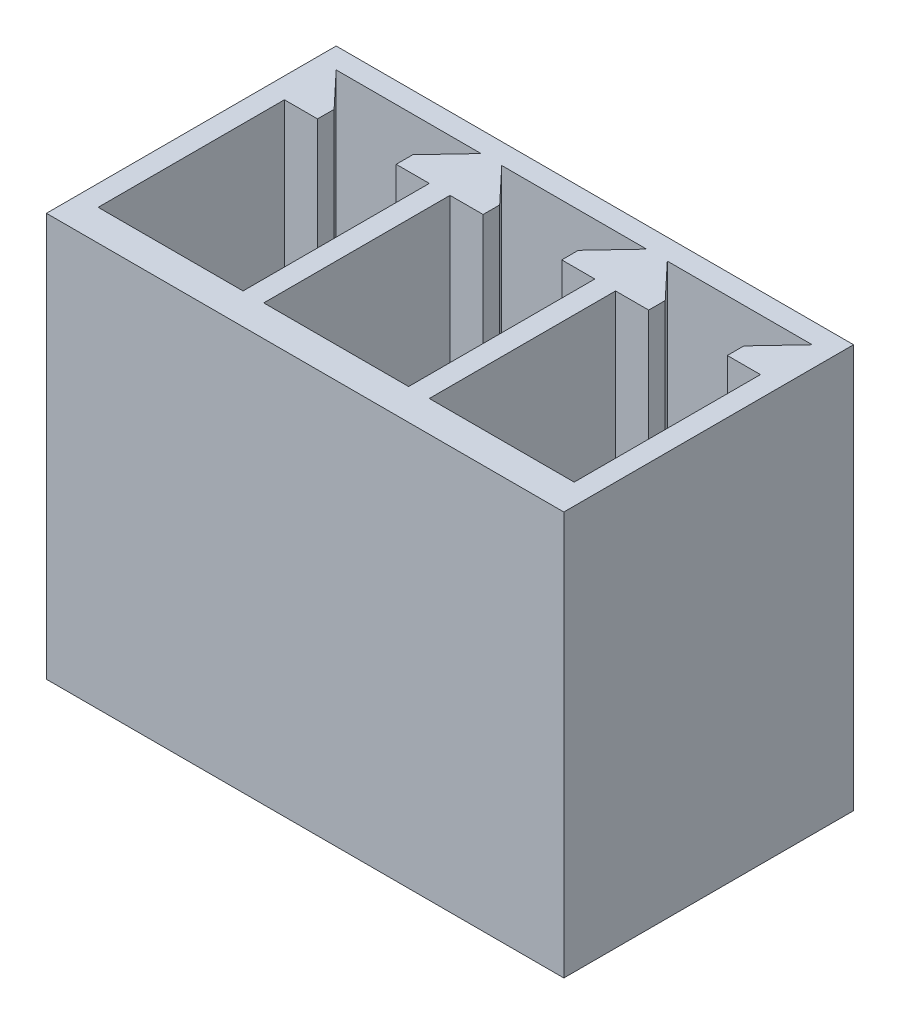
ISO-10303-21;
HEADER;
FILE_DESCRIPTION(('STEP AP214'),'2;1');
FILE_NAME('part.step','',(''),(''),'','','');
FILE_SCHEMA(('AUTOMOTIVE_DESIGN { 1 0 10303 214 1 1 1 1 }'));
ENDSEC;
DATA;
#1=APPLICATION_CONTEXT('core data for automotive mechanical design processes');
#2=APPLICATION_PROTOCOL_DEFINITION('international standard','automotive_design',2000,#1);
#3=PRODUCT_CONTEXT('',#1,'mechanical');
#4=PRODUCT('Part','Part','',(#3));
#5=PRODUCT_RELATED_PRODUCT_CATEGORY('part','',(#4));
#6=PRODUCT_DEFINITION_FORMATION('','',#4);
#7=PRODUCT_DEFINITION_CONTEXT('part definition',#1,'design');
#8=PRODUCT_DEFINITION('design','',#6,#7);
#9=PRODUCT_DEFINITION_SHAPE('','',#8);
#10=(LENGTH_UNIT() NAMED_UNIT(*) SI_UNIT(.MILLI.,.METRE.));
#11=(NAMED_UNIT(*) PLANE_ANGLE_UNIT() SI_UNIT($,.RADIAN.));
#12=(NAMED_UNIT(*) SI_UNIT($,.STERADIAN.) SOLID_ANGLE_UNIT());
#13=UNCERTAINTY_MEASURE_WITH_UNIT(LENGTH_MEASURE(1.E-05),#10,'distance_accuracy_value','');
#14=(GEOMETRIC_REPRESENTATION_CONTEXT(3) GLOBAL_UNCERTAINTY_ASSIGNED_CONTEXT((#13)) GLOBAL_UNIT_ASSIGNED_CONTEXT((#10,
#11,#12)) REPRESENTATION_CONTEXT('',''));
#15=CARTESIAN_POINT('',(0.,0.,0.));
#16=DIRECTION('',(0.,0.,1.));
#17=DIRECTION('',(1.,0.,0.));
#18=AXIS2_PLACEMENT_3D('',#15,#16,#17);
#19=CARTESIAN_POINT('',(0.,9.25,0.));
#20=DIRECTION('',(0.,1.,0.));
#21=DIRECTION('',(0.,0.,1.));
#22=AXIS2_PLACEMENT_3D('',#19,#20,#21);
#23=PLANE('',#22);
#24=DIRECTION('',(1.,0.,0.));
#25=VECTOR('',#24,1.);
#26=CARTESIAN_POINT('',(-6.24999999999998,9.25,0.));
#27=LINE('',#26,#25);
#28=CARTESIAN_POINT('',(-6.24999999999998,9.25,0.));
#29=VERTEX_POINT('',#28);
#30=CARTESIAN_POINT('',(6.25000000000001,9.25,0.));
#31=VERTEX_POINT('',#30);
#32=EDGE_CURVE('E491',#29,#31,#27,.T.);
#33=ORIENTED_EDGE('',*,*,#32,.T.);
#34=DIRECTION('',(0.,0.,-1.));
#35=VECTOR('',#34,1.);
#36=CARTESIAN_POINT('',(6.25000000000001,9.25,0.));
#37=LINE('',#36,#35);
#38=CARTESIAN_POINT('',(6.25000000000001,9.25,-6.99999999999999));
#39=VERTEX_POINT('',#38);
#40=EDGE_CURVE('E258',#31,#39,#37,.T.);
#41=ORIENTED_EDGE('',*,*,#40,.T.);
#42=DIRECTION('',(-1.,0.,0.));
#43=VECTOR('',#42,1.);
#44=CARTESIAN_POINT('',(6.25000000000001,9.25,-6.99999999999999));
#45=LINE('',#44,#43);
#46=CARTESIAN_POINT('',(-6.24999999999998,9.25,-6.99999999999999));
#47=VERTEX_POINT('',#46);
#48=EDGE_CURVE('E494',#39,#47,#45,.T.);
#49=ORIENTED_EDGE('',*,*,#48,.T.);
#50=DIRECTION('',(0.,0.,1.));
#51=VECTOR('',#50,1.);
#52=CARTESIAN_POINT('',(-6.24999999999998,9.25,-6.99999999999999));
#53=LINE('',#52,#51);
#54=EDGE_CURVE('E496',#47,#29,#53,.T.);
#55=ORIENTED_EDGE('',*,*,#54,.T.);
#56=EDGE_LOOP('',(#33,#41,#49,#55));
#57=FACE_BOUND('',#56,.T.);
#58=DIRECTION('',(0.,0.,1.));
#59=VECTOR('',#58,1.);
#60=CARTESIAN_POINT('',(-5.74999999999998,9.25,-5.25));
#61=LINE('',#60,#59);
#62=CARTESIAN_POINT('',(-5.74999999999998,9.25,-5.25));
#63=VERTEX_POINT('',#62);
#64=CARTESIAN_POINT('',(-5.74999999999998,9.25,-0.750000000000001));
#65=VERTEX_POINT('',#64);
#66=EDGE_CURVE('E422',#63,#65,#61,.T.);
#67=ORIENTED_EDGE('',*,*,#66,.F.);
#68=DIRECTION('',(-1.,0.,0.));
#69=VECTOR('',#68,1.);
#70=CARTESIAN_POINT('',(-4.94999999999998,9.25,-5.25));
#71=LINE('',#70,#69);
#72=CARTESIAN_POINT('',(-4.94999999999998,9.25,-5.25));
#73=VERTEX_POINT('',#72);
#74=EDGE_CURVE('E420',#73,#63,#71,.T.);
#75=ORIENTED_EDGE('',*,*,#74,.F.);
#76=DIRECTION('',(0.,0.,1.));
#77=VECTOR('',#76,1.);
#78=CARTESIAN_POINT('',(-4.94999999999998,9.25,-5.65));
#79=LINE('',#78,#77);
#80=CARTESIAN_POINT('',(-4.94999999999998,9.25,-5.65));
#81=VERTEX_POINT('',#80);
#82=EDGE_CURVE('E440',#81,#73,#79,.T.);
#83=ORIENTED_EDGE('',*,*,#82,.F.);
#84=DIRECTION('',(0.685364699004987,0.,0.728199992692806));
#85=VECTOR('',#84,1.);
#86=CARTESIAN_POINT('',(-5.74999999999998,9.25,-6.50000000000001));
#87=LINE('',#86,#85);
#88=CARTESIAN_POINT('',(-5.74999999999998,9.25,-6.50000000000001));
#89=VERTEX_POINT('',#88);
#90=EDGE_CURVE('E437',#89,#81,#87,.T.);
#91=ORIENTED_EDGE('',*,*,#90,.F.);
#92=DIRECTION('',(-1.,0.,0.));
#93=VECTOR('',#92,1.);
#94=CARTESIAN_POINT('',(-2.24999999999997,9.25,-6.50000000000001));
#95=LINE('',#94,#93);
#96=CARTESIAN_POINT('',(-2.24999999999997,9.25,-6.50000000000001));
#97=VERTEX_POINT('',#96);
#98=EDGE_CURVE('E435',#97,#89,#95,.T.);
#99=ORIENTED_EDGE('',*,*,#98,.F.);
#100=DIRECTION('',(0.685364699005,0.,-0.728199992692795));
#101=VECTOR('',#100,1.);
#102=CARTESIAN_POINT('',(-3.05,9.25,-5.65));
#103=LINE('',#102,#101);
#104=CARTESIAN_POINT('',(-3.05,9.25,-5.65));
#105=VERTEX_POINT('',#104);
#106=EDGE_CURVE('E433',#105,#97,#103,.T.);
#107=ORIENTED_EDGE('',*,*,#106,.F.);
#108=DIRECTION('',(0.,0.,-1.));
#109=VECTOR('',#108,1.);
#110=CARTESIAN_POINT('',(-3.05,9.25,-5.25));
#111=LINE('',#110,#109);
#112=CARTESIAN_POINT('',(-3.05,9.25,-5.25));
#113=VERTEX_POINT('',#112);
#114=EDGE_CURVE('E431',#113,#105,#111,.T.);
#115=ORIENTED_EDGE('',*,*,#114,.F.);
#116=DIRECTION('',(-1.,0.,0.));
#117=VECTOR('',#116,1.);
#118=CARTESIAN_POINT('',(-2.24999999999997,9.25,-5.25));
#119=LINE('',#118,#117);
#120=CARTESIAN_POINT('',(-2.24999999999997,9.25,-5.25));
#121=VERTEX_POINT('',#120);
#122=EDGE_CURVE('E429',#121,#113,#119,.T.);
#123=ORIENTED_EDGE('',*,*,#122,.F.);
#124=DIRECTION('',(0.,0.,-1.));
#125=VECTOR('',#124,1.);
#126=CARTESIAN_POINT('',(-2.24999999999997,9.25,-0.750000000000001));
#127=LINE('',#126,#125);
#128=CARTESIAN_POINT('',(-2.24999999999997,9.25,-0.750000000000001));
#129=VERTEX_POINT('',#128);
#130=EDGE_CURVE('E427',#129,#121,#127,.T.);
#131=ORIENTED_EDGE('',*,*,#130,.F.);
#132=DIRECTION('',(1.,0.,0.));
#133=VECTOR('',#132,1.);
#134=CARTESIAN_POINT('',(-5.74999999999998,9.25,-0.750000000000001));
#135=LINE('',#134,#133);
#136=EDGE_CURVE('E425',#65,#129,#135,.T.);
#137=ORIENTED_EDGE('',*,*,#136,.F.);
#138=EDGE_LOOP('',(#67,#75,#83,#91,#99,#107,#115,#123,#131,#137));
#139=FACE_BOUND('',#138,.T.);
#140=DIRECTION('',(0.,0.,1.));
#141=VECTOR('',#140,1.);
#142=CARTESIAN_POINT('',(-1.74999999999997,9.25,-5.25));
#143=LINE('',#142,#141);
#144=CARTESIAN_POINT('',(-1.74999999999997,9.25,-5.25));
#145=VERTEX_POINT('',#144);
#146=CARTESIAN_POINT('',(-1.74999999999997,9.25,-0.750000000000001));
#147=VERTEX_POINT('',#146);
#148=EDGE_CURVE('E352',#145,#147,#143,.T.);
#149=ORIENTED_EDGE('',*,*,#148,.F.);
#150=DIRECTION('',(-1.,0.,0.));
#151=VECTOR('',#150,1.);
#152=CARTESIAN_POINT('',(-0.950000000000006,9.25,-5.25));
#153=LINE('',#152,#151);
#154=CARTESIAN_POINT('',(-0.950000000000006,9.25,-5.25));
#155=VERTEX_POINT('',#154);
#156=EDGE_CURVE('E350',#155,#145,#153,.T.);
#157=ORIENTED_EDGE('',*,*,#156,.F.);
#158=DIRECTION('',(0.,0.,1.));
#159=VECTOR('',#158,1.);
#160=CARTESIAN_POINT('',(-0.950000000000006,9.25,-5.65));
#161=LINE('',#160,#159);
#162=CARTESIAN_POINT('',(-0.950000000000006,9.25,-5.65));
#163=VERTEX_POINT('',#162);
#164=EDGE_CURVE('E369',#163,#155,#161,.T.);
#165=ORIENTED_EDGE('',*,*,#164,.F.);
#166=DIRECTION('',(0.685364699004975,0.,0.728199992692818));
#167=VECTOR('',#166,1.);
#168=CARTESIAN_POINT('',(-1.74999999999997,9.25,-6.50000000000001));
#169=LINE('',#168,#167);
#170=CARTESIAN_POINT('',(-1.74999999999997,9.25,-6.50000000000001));
#171=VERTEX_POINT('',#170);
#172=EDGE_CURVE('E367',#171,#163,#169,.T.);
#173=ORIENTED_EDGE('',*,*,#172,.F.);
#174=DIRECTION('',(-1.,0.,0.));
#175=VECTOR('',#174,1.);
#176=CARTESIAN_POINT('',(1.75000000000003,9.25,-6.50000000000001));
#177=LINE('',#176,#175);
#178=CARTESIAN_POINT('',(1.75000000000003,9.25,-6.50000000000001));
#179=VERTEX_POINT('',#178);
#180=EDGE_CURVE('E365',#179,#171,#177,.T.);
#181=ORIENTED_EDGE('',*,*,#180,.F.);
#182=DIRECTION('',(0.685364699005,0.,-0.728199992692795));
#183=VECTOR('',#182,1.);
#184=CARTESIAN_POINT('',(0.950000000000006,9.25,-5.65));
#185=LINE('',#184,#183);
#186=CARTESIAN_POINT('',(0.950000000000006,9.25,-5.65));
#187=VERTEX_POINT('',#186);
#188=EDGE_CURVE('E363',#187,#179,#185,.T.);
#189=ORIENTED_EDGE('',*,*,#188,.F.);
#190=DIRECTION('',(0.,0.,-1.));
#191=VECTOR('',#190,1.);
#192=CARTESIAN_POINT('',(0.950000000000006,9.25,-5.25));
#193=LINE('',#192,#191);
#194=CARTESIAN_POINT('',(0.950000000000006,9.25,-5.25));
#195=VERTEX_POINT('',#194);
#196=EDGE_CURVE('E361',#195,#187,#193,.T.);
#197=ORIENTED_EDGE('',*,*,#196,.F.);
#198=DIRECTION('',(-1.,0.,0.));
#199=VECTOR('',#198,1.);
#200=CARTESIAN_POINT('',(1.75000000000003,9.25,-5.25));
#201=LINE('',#200,#199);
#202=CARTESIAN_POINT('',(1.75000000000003,9.25,-5.25));
#203=VERTEX_POINT('',#202);
#204=EDGE_CURVE('E359',#203,#195,#201,.T.);
#205=ORIENTED_EDGE('',*,*,#204,.F.);
#206=DIRECTION('',(0.,0.,-1.));
#207=VECTOR('',#206,1.);
#208=CARTESIAN_POINT('',(1.75000000000003,9.25,-0.750000000000001));
#209=LINE('',#208,#207);
#210=CARTESIAN_POINT('',(1.75000000000003,9.25,-0.750000000000001));
#211=VERTEX_POINT('',#210);
#212=EDGE_CURVE('E357',#211,#203,#209,.T.);
#213=ORIENTED_EDGE('',*,*,#212,.F.);
#214=DIRECTION('',(1.,0.,0.));
#215=VECTOR('',#214,1.);
#216=CARTESIAN_POINT('',(-1.74999999999997,9.25,-0.750000000000001));
#217=LINE('',#216,#215);
#218=EDGE_CURVE('E355',#147,#211,#217,.T.);
#219=ORIENTED_EDGE('',*,*,#218,.F.);
#220=EDGE_LOOP('',(#149,#157,#165,#173,#181,#189,#197,#205,#213,#219));
#221=FACE_BOUND('',#220,.T.);
#222=DIRECTION('',(0.,0.,1.));
#223=VECTOR('',#222,1.);
#224=CARTESIAN_POINT('',(2.25000000000003,9.25,-5.25));
#225=LINE('',#224,#223);
#226=CARTESIAN_POINT('',(2.25000000000003,9.25,-5.25));
#227=VERTEX_POINT('',#226);
#228=CARTESIAN_POINT('',(2.25000000000003,9.25,-0.750000000000001));
#229=VERTEX_POINT('',#228);
#230=EDGE_CURVE('E282',#227,#229,#225,.T.);
#231=ORIENTED_EDGE('',*,*,#230,.F.);
#232=DIRECTION('',(-1.,0.,0.));
#233=VECTOR('',#232,1.);
#234=CARTESIAN_POINT('',(3.05,9.25,-5.25));
#235=LINE('',#234,#233);
#236=CARTESIAN_POINT('',(3.05,9.25,-5.25));
#237=VERTEX_POINT('',#236);
#238=EDGE_CURVE('E280',#237,#227,#235,.T.);
#239=ORIENTED_EDGE('',*,*,#238,.F.);
#240=DIRECTION('',(0.,0.,1.));
#241=VECTOR('',#240,1.);
#242=CARTESIAN_POINT('',(3.05,9.25,-5.65));
#243=LINE('',#242,#241);
#244=CARTESIAN_POINT('',(3.05,9.25,-5.65));
#245=VERTEX_POINT('',#244);
#246=EDGE_CURVE('E299',#245,#237,#243,.T.);
#247=ORIENTED_EDGE('',*,*,#246,.F.);
#248=DIRECTION('',(0.685364699004975,0.,0.728199992692818));
#249=VECTOR('',#248,1.);
#250=CARTESIAN_POINT('',(2.25000000000003,9.25,-6.50000000000001));
#251=LINE('',#250,#249);
#252=CARTESIAN_POINT('',(2.25000000000003,9.25,-6.50000000000001));
#253=VERTEX_POINT('',#252);
#254=EDGE_CURVE('E297',#253,#245,#251,.T.);
#255=ORIENTED_EDGE('',*,*,#254,.F.);
#256=DIRECTION('',(-1.,0.,0.));
#257=VECTOR('',#256,1.);
#258=CARTESIAN_POINT('',(5.75000000000003,9.25,-6.50000000000002));
#259=LINE('',#258,#257);
#260=CARTESIAN_POINT('',(5.75000000000003,9.25,-6.50000000000002));
#261=VERTEX_POINT('',#260);
#262=EDGE_CURVE('E295',#261,#253,#259,.T.);
#263=ORIENTED_EDGE('',*,*,#262,.F.);
#264=DIRECTION('',(0.685364699005,0.,-0.728199992692795));
#265=VECTOR('',#264,1.);
#266=CARTESIAN_POINT('',(4.95000000000001,9.25,-5.65000000000002));
#267=LINE('',#266,#265);
#268=CARTESIAN_POINT('',(4.95000000000001,9.25,-5.65000000000002));
#269=VERTEX_POINT('',#268);
#270=EDGE_CURVE('E293',#269,#261,#267,.T.);
#271=ORIENTED_EDGE('',*,*,#270,.F.);
#272=DIRECTION('',(0.,0.,-1.));
#273=VECTOR('',#272,1.);
#274=CARTESIAN_POINT('',(4.95000000000001,9.25,-5.25000000000002));
#275=LINE('',#274,#273);
#276=CARTESIAN_POINT('',(4.95000000000001,9.25,-5.25000000000002));
#277=VERTEX_POINT('',#276);
#278=EDGE_CURVE('E291',#277,#269,#275,.T.);
#279=ORIENTED_EDGE('',*,*,#278,.F.);
#280=DIRECTION('',(-1.,0.,0.));
#281=VECTOR('',#280,1.);
#282=CARTESIAN_POINT('',(5.75000000000003,9.25,-5.25000000000002));
#283=LINE('',#282,#281);
#284=CARTESIAN_POINT('',(5.75000000000003,9.25,-5.25000000000002));
#285=VERTEX_POINT('',#284);
#286=EDGE_CURVE('E289',#285,#277,#283,.T.);
#287=ORIENTED_EDGE('',*,*,#286,.F.);
#288=DIRECTION('',(0.,0.,-1.));
#289=VECTOR('',#288,1.);
#290=CARTESIAN_POINT('',(5.75000000000003,9.25,-0.750000000000015));
#291=LINE('',#290,#289);
#292=CARTESIAN_POINT('',(5.75000000000003,9.25,-0.750000000000015));
#293=VERTEX_POINT('',#292);
#294=EDGE_CURVE('E287',#293,#285,#291,.T.);
#295=ORIENTED_EDGE('',*,*,#294,.F.);
#296=DIRECTION('',(1.,0.,0.));
#297=VECTOR('',#296,1.);
#298=CARTESIAN_POINT('',(2.25000000000003,9.25,-0.750000000000001));
#299=LINE('',#298,#297);
#300=EDGE_CURVE('E285',#229,#293,#299,.T.);
#301=ORIENTED_EDGE('',*,*,#300,.F.);
#302=EDGE_LOOP('',(#231,#239,#247,#255,#263,#271,#279,#287,#295,#301));
#303=FACE_BOUND('',#302,.T.);
#304=ADVANCED_FACE('F33',(#57,#139,#221,#303),#23,.T.);
#305=CARTESIAN_POINT('',(-6.24999999999998,9.25,0.));
#306=DIRECTION('',(0.,0.,-1.));
#307=DIRECTION('',(-1.,0.,0.));
#308=AXIS2_PLACEMENT_3D('',#305,#306,#307);
#309=PLANE('',#308);
#310=DIRECTION('',(0.,-1.,0.));
#311=VECTOR('',#310,1.);
#312=CARTESIAN_POINT('',(-6.24999999999998,9.25,0.));
#313=LINE('',#312,#311);
#314=CARTESIAN_POINT('',(-6.24999999999998,-0.5,0.));
#315=VERTEX_POINT('',#314);
#316=EDGE_CURVE('E265',#29,#315,#313,.T.);
#317=ORIENTED_EDGE('',*,*,#316,.T.);
#318=DIRECTION('',(-1.,0.,0.));
#319=VECTOR('',#318,1.);
#320=CARTESIAN_POINT('',(6.25000000000001,-0.5,0.));
#321=LINE('',#320,#319);
#322=CARTESIAN_POINT('',(6.25000000000001,-0.5,0.));
#323=VERTEX_POINT('',#322);
#324=EDGE_CURVE('E263',#323,#315,#321,.T.);
#325=ORIENTED_EDGE('',*,*,#324,.F.);
#326=DIRECTION('',(0.,-1.,0.));
#327=VECTOR('',#326,1.);
#328=CARTESIAN_POINT('',(6.25000000000001,9.25,0.));
#329=LINE('',#328,#327);
#330=EDGE_CURVE('E11',#31,#323,#329,.T.);
#331=ORIENTED_EDGE('',*,*,#330,.F.);
#332=ORIENTED_EDGE('',*,*,#32,.F.);
#333=EDGE_LOOP('',(#317,#325,#331,#332));
#334=FACE_BOUND('',#333,.T.);
#335=ADVANCED_FACE('F35',(#334),#309,.F.);
#336=CARTESIAN_POINT('',(6.25000000000001,9.25,0.));
#337=DIRECTION('',(-1.,0.,0.));
#338=DIRECTION('',(0.,0.,1.));
#339=AXIS2_PLACEMENT_3D('',#336,#337,#338);
#340=PLANE('',#339);
#341=ORIENTED_EDGE('',*,*,#330,.T.);
#342=DIRECTION('',(0.,0.,1.));
#343=VECTOR('',#342,1.);
#344=CARTESIAN_POINT('',(6.25000000000001,-0.5,-6.99999999999999));
#345=LINE('',#344,#343);
#346=CARTESIAN_POINT('',(6.25000000000001,-0.5,-6.99999999999999));
#347=VERTEX_POINT('',#346);
#348=EDGE_CURVE('E257',#347,#323,#345,.T.);
#349=ORIENTED_EDGE('',*,*,#348,.F.);
#350=DIRECTION('',(0.,-1.,0.));
#351=VECTOR('',#350,1.);
#352=CARTESIAN_POINT('',(6.25000000000001,9.25,-6.99999999999999));
#353=LINE('',#352,#351);
#354=EDGE_CURVE('E41',#39,#347,#353,.T.);
#355=ORIENTED_EDGE('',*,*,#354,.F.);
#356=ORIENTED_EDGE('',*,*,#40,.F.);
#357=EDGE_LOOP('',(#341,#349,#355,#356));
#358=FACE_BOUND('',#357,.T.);
#359=ADVANCED_FACE('F254',(#358),#340,.F.);
#360=CARTESIAN_POINT('',(6.25000000000001,9.25,-6.99999999999999));
#361=DIRECTION('',(0.,0.,1.));
#362=DIRECTION('',(1.,0.,0.));
#363=AXIS2_PLACEMENT_3D('',#360,#361,#362);
#364=PLANE('',#363);
#365=ORIENTED_EDGE('',*,*,#354,.T.);
#366=DIRECTION('',(1.,0.,0.));
#367=VECTOR('',#366,1.);
#368=CARTESIAN_POINT('',(-6.24999999999998,-0.5,-6.99999999999999));
#369=LINE('',#368,#367);
#370=CARTESIAN_POINT('',(-6.24999999999998,-0.5,-6.99999999999999));
#371=VERTEX_POINT('',#370);
#372=EDGE_CURVE('E274',#371,#347,#369,.T.);
#373=ORIENTED_EDGE('',*,*,#372,.F.);
#374=DIRECTION('',(0.,-1.,0.));
#375=VECTOR('',#374,1.);
#376=CARTESIAN_POINT('',(-6.24999999999998,9.25,-6.99999999999999));
#377=LINE('',#376,#375);
#378=EDGE_CURVE('E499',#47,#371,#377,.T.);
#379=ORIENTED_EDGE('',*,*,#378,.F.);
#380=ORIENTED_EDGE('',*,*,#48,.F.);
#381=EDGE_LOOP('',(#365,#373,#379,#380));
#382=FACE_BOUND('',#381,.T.);
#383=ADVANCED_FACE('F502',(#382),#364,.F.);
#384=CARTESIAN_POINT('',(-6.24999999999998,9.25,-6.99999999999999));
#385=DIRECTION('',(1.,0.,0.));
#386=DIRECTION('',(0.,0.,-1.));
#387=AXIS2_PLACEMENT_3D('',#384,#385,#386);
#388=PLANE('',#387);
#389=ORIENTED_EDGE('',*,*,#378,.T.);
#390=DIRECTION('',(0.,0.,-1.));
#391=VECTOR('',#390,1.);
#392=CARTESIAN_POINT('',(-6.24999999999998,-0.5,0.));
#393=LINE('',#392,#391);
#394=EDGE_CURVE('E269',#315,#371,#393,.T.);
#395=ORIENTED_EDGE('',*,*,#394,.F.);
#396=ORIENTED_EDGE('',*,*,#316,.F.);
#397=ORIENTED_EDGE('',*,*,#54,.F.);
#398=EDGE_LOOP('',(#389,#395,#396,#397));
#399=FACE_BOUND('',#398,.T.);
#400=ADVANCED_FACE('F508',(#399),#388,.F.);
#401=CARTESIAN_POINT('',(-4.94999999999998,9.25,-5.25));
#402=DIRECTION('',(0.,0.,1.));
#403=DIRECTION('',(1.,0.,0.));
#404=AXIS2_PLACEMENT_3D('',#401,#402,#403);
#405=PLANE('',#404);
#406=DIRECTION('',(-1.,0.,0.));
#407=VECTOR('',#406,1.);
#408=CARTESIAN_POINT('',(-4.94999999999998,0.,-5.25));
#409=LINE('',#408,#407);
#410=CARTESIAN_POINT('',(-4.94999999999998,0.,-5.25));
#411=VERTEX_POINT('',#410);
#412=CARTESIAN_POINT('',(-5.74999999999998,0.,-5.25));
#413=VERTEX_POINT('',#412);
#414=EDGE_CURVE('E419',#411,#413,#409,.T.);
#415=ORIENTED_EDGE('',*,*,#414,.F.);
#416=DIRECTION('',(0.,-1.,0.));
#417=VECTOR('',#416,1.);
#418=CARTESIAN_POINT('',(-4.94999999999998,9.25,-5.25));
#419=LINE('',#418,#417);
#420=EDGE_CURVE('E442',#73,#411,#419,.T.);
#421=ORIENTED_EDGE('',*,*,#420,.F.);
#422=ORIENTED_EDGE('',*,*,#74,.T.);
#423=DIRECTION('',(0.,-1.,0.));
#424=VECTOR('',#423,1.);
#425=CARTESIAN_POINT('',(-5.74999999999998,9.25,-5.25));
#426=LINE('',#425,#424);
#427=EDGE_CURVE('E488',#63,#413,#426,.T.);
#428=ORIENTED_EDGE('',*,*,#427,.T.);
#429=EDGE_LOOP('',(#415,#421,#422,#428));
#430=FACE_BOUND('',#429,.T.);
#431=ADVANCED_FACE('F510',(#430),#405,.T.);
#432=CARTESIAN_POINT('',(-5.74999999999998,9.25,-5.25));
#433=DIRECTION('',(1.,0.,0.));
#434=DIRECTION('',(0.,0.,-1.));
#435=AXIS2_PLACEMENT_3D('',#432,#433,#434);
#436=PLANE('',#435);
#437=DIRECTION('',(0.,0.,1.));
#438=VECTOR('',#437,1.);
#439=CARTESIAN_POINT('',(-5.74999999999998,0.,-5.25));
#440=LINE('',#439,#438);
#441=CARTESIAN_POINT('',(-5.74999999999998,0.,-0.750000000000001));
#442=VERTEX_POINT('',#441);
#443=EDGE_CURVE('E445',#413,#442,#440,.T.);
#444=ORIENTED_EDGE('',*,*,#443,.F.);
#445=ORIENTED_EDGE('',*,*,#427,.F.);
#446=ORIENTED_EDGE('',*,*,#66,.T.);
#447=DIRECTION('',(0.,-1.,0.));
#448=VECTOR('',#447,1.);
#449=CARTESIAN_POINT('',(-5.74999999999998,9.25,-0.750000000000001));
#450=LINE('',#449,#448);
#451=EDGE_CURVE('E486',#65,#442,#450,.T.);
#452=ORIENTED_EDGE('',*,*,#451,.T.);
#453=EDGE_LOOP('',(#444,#445,#446,#452));
#454=FACE_BOUND('',#453,.T.);
#455=ADVANCED_FACE('F516',(#454),#436,.T.);
#456=CARTESIAN_POINT('',(-5.74999999999998,9.25,-0.750000000000001));
#457=DIRECTION('',(0.,0.,-1.));
#458=DIRECTION('',(-1.,0.,0.));
#459=AXIS2_PLACEMENT_3D('',#456,#457,#458);
#460=PLANE('',#459);
#461=DIRECTION('',(1.,0.,0.));
#462=VECTOR('',#461,1.);
#463=CARTESIAN_POINT('',(-5.74999999999998,0.,-0.750000000000001));
#464=LINE('',#463,#462);
#465=CARTESIAN_POINT('',(-2.24999999999997,0.,-0.750000000000001));
#466=VERTEX_POINT('',#465);
#467=EDGE_CURVE('E448',#442,#466,#464,.T.);
#468=ORIENTED_EDGE('',*,*,#467,.F.);
#469=ORIENTED_EDGE('',*,*,#451,.F.);
#470=ORIENTED_EDGE('',*,*,#136,.T.);
#471=DIRECTION('',(0.,-1.,0.));
#472=VECTOR('',#471,1.);
#473=CARTESIAN_POINT('',(-2.24999999999997,9.25,-0.750000000000001));
#474=LINE('',#473,#472);
#475=EDGE_CURVE('E484',#129,#466,#474,.T.);
#476=ORIENTED_EDGE('',*,*,#475,.T.);
#477=EDGE_LOOP('',(#468,#469,#470,#476));
#478=FACE_BOUND('',#477,.T.);
#479=ADVANCED_FACE('F528',(#478),#460,.T.);
#480=CARTESIAN_POINT('',(-2.24999999999997,9.25,-0.750000000000001));
#481=DIRECTION('',(-1.,0.,0.));
#482=DIRECTION('',(0.,0.,1.));
#483=AXIS2_PLACEMENT_3D('',#480,#481,#482);
#484=PLANE('',#483);
#485=DIRECTION('',(0.,0.,-1.));
#486=VECTOR('',#485,1.);
#487=CARTESIAN_POINT('',(-2.24999999999997,0.,-0.750000000000001));
#488=LINE('',#487,#486);
#489=CARTESIAN_POINT('',(-2.24999999999997,0.,-5.25));
#490=VERTEX_POINT('',#489);
#491=EDGE_CURVE('E451',#466,#490,#488,.T.);
#492=ORIENTED_EDGE('',*,*,#491,.F.);
#493=ORIENTED_EDGE('',*,*,#475,.F.);
#494=ORIENTED_EDGE('',*,*,#130,.T.);
#495=DIRECTION('',(0.,-1.,0.));
#496=VECTOR('',#495,1.);
#497=CARTESIAN_POINT('',(-2.24999999999997,9.25,-5.25));
#498=LINE('',#497,#496);
#499=EDGE_CURVE('E482',#121,#490,#498,.T.);
#500=ORIENTED_EDGE('',*,*,#499,.T.);
#501=EDGE_LOOP('',(#492,#493,#494,#500));
#502=FACE_BOUND('',#501,.T.);
#503=ADVANCED_FACE('F532',(#502),#484,.T.);
#504=CARTESIAN_POINT('',(-2.24999999999997,9.25,-5.25));
#505=DIRECTION('',(0.,0.,1.));
#506=DIRECTION('',(1.,0.,0.));
#507=AXIS2_PLACEMENT_3D('',#504,#505,#506);
#508=PLANE('',#507);
#509=DIRECTION('',(-1.,0.,0.));
#510=VECTOR('',#509,1.);
#511=CARTESIAN_POINT('',(-2.24999999999997,0.,-5.25));
#512=LINE('',#511,#510);
#513=CARTESIAN_POINT('',(-3.05,0.,-5.25));
#514=VERTEX_POINT('',#513);
#515=EDGE_CURVE('E454',#490,#514,#512,.T.);
#516=ORIENTED_EDGE('',*,*,#515,.F.);
#517=ORIENTED_EDGE('',*,*,#499,.F.);
#518=ORIENTED_EDGE('',*,*,#122,.T.);
#519=DIRECTION('',(0.,-1.,0.));
#520=VECTOR('',#519,1.);
#521=CARTESIAN_POINT('',(-3.05,9.25,-5.25));
#522=LINE('',#521,#520);
#523=EDGE_CURVE('E480',#113,#514,#522,.T.);
#524=ORIENTED_EDGE('',*,*,#523,.T.);
#525=EDGE_LOOP('',(#516,#517,#518,#524));
#526=FACE_BOUND('',#525,.T.);
#527=ADVANCED_FACE('F536',(#526),#508,.T.);
#528=CARTESIAN_POINT('',(-3.05,9.25,-5.25));
#529=DIRECTION('',(-1.,0.,0.));
#530=DIRECTION('',(0.,0.,1.));
#531=AXIS2_PLACEMENT_3D('',#528,#529,#530);
#532=PLANE('',#531);
#533=DIRECTION('',(0.,0.,-1.));
#534=VECTOR('',#533,1.);
#535=CARTESIAN_POINT('',(-3.05,0.,-5.25));
#536=LINE('',#535,#534);
#537=CARTESIAN_POINT('',(-3.05,0.,-5.65));
#538=VERTEX_POINT('',#537);
#539=EDGE_CURVE('E457',#514,#538,#536,.T.);
#540=ORIENTED_EDGE('',*,*,#539,.F.);
#541=ORIENTED_EDGE('',*,*,#523,.F.);
#542=ORIENTED_EDGE('',*,*,#114,.T.);
#543=DIRECTION('',(0.,-1.,0.));
#544=VECTOR('',#543,1.);
#545=CARTESIAN_POINT('',(-3.05,9.25,-5.65));
#546=LINE('',#545,#544);
#547=EDGE_CURVE('E478',#105,#538,#546,.T.);
#548=ORIENTED_EDGE('',*,*,#547,.T.);
#549=EDGE_LOOP('',(#540,#541,#542,#548));
#550=FACE_BOUND('',#549,.T.);
#551=ADVANCED_FACE('F540',(#550),#532,.T.);
#552=CARTESIAN_POINT('',(-3.05,9.25,-5.65));
#553=DIRECTION('',(-0.728199992692795,0.,-0.685364699005));
#554=DIRECTION('',(-0.685364699005,0.,0.728199992692795));
#555=AXIS2_PLACEMENT_3D('',#552,#553,#554);
#556=PLANE('',#555);
#557=DIRECTION('',(0.685364699005,0.,-0.728199992692795));
#558=VECTOR('',#557,1.);
#559=CARTESIAN_POINT('',(-3.05,0.,-5.65));
#560=LINE('',#559,#558);
#561=CARTESIAN_POINT('',(-2.24999999999997,0.,-6.50000000000001));
#562=VERTEX_POINT('',#561);
#563=EDGE_CURVE('E460',#538,#562,#560,.T.);
#564=ORIENTED_EDGE('',*,*,#563,.F.);
#565=ORIENTED_EDGE('',*,*,#547,.F.);
#566=ORIENTED_EDGE('',*,*,#106,.T.);
#567=DIRECTION('',(0.,-1.,0.));
#568=VECTOR('',#567,1.);
#569=CARTESIAN_POINT('',(-2.24999999999997,9.25,-6.50000000000001));
#570=LINE('',#569,#568);
#571=EDGE_CURVE('E476',#97,#562,#570,.T.);
#572=ORIENTED_EDGE('',*,*,#571,.T.);
#573=EDGE_LOOP('',(#564,#565,#566,#572));
#574=FACE_BOUND('',#573,.T.);
#575=ADVANCED_FACE('F544',(#574),#556,.T.);
#576=CARTESIAN_POINT('',(-2.24999999999997,9.25,-6.50000000000001));
#577=DIRECTION('',(0.,0.,1.));
#578=DIRECTION('',(1.,0.,0.));
#579=AXIS2_PLACEMENT_3D('',#576,#577,#578);
#580=PLANE('',#579);
#581=DIRECTION('',(-1.,0.,0.));
#582=VECTOR('',#581,1.);
#583=CARTESIAN_POINT('',(-2.24999999999997,0.,-6.50000000000001));
#584=LINE('',#583,#582);
#585=CARTESIAN_POINT('',(-5.74999999999998,0.,-6.50000000000001));
#586=VERTEX_POINT('',#585);
#587=EDGE_CURVE('E463',#562,#586,#584,.T.);
#588=ORIENTED_EDGE('',*,*,#587,.F.);
#589=ORIENTED_EDGE('',*,*,#571,.F.);
#590=ORIENTED_EDGE('',*,*,#98,.T.);
#591=DIRECTION('',(0.,-1.,0.));
#592=VECTOR('',#591,1.);
#593=CARTESIAN_POINT('',(-5.74999999999998,9.25,-6.50000000000001));
#594=LINE('',#593,#592);
#595=EDGE_CURVE('E474',#89,#586,#594,.T.);
#596=ORIENTED_EDGE('',*,*,#595,.T.);
#597=EDGE_LOOP('',(#588,#589,#590,#596));
#598=FACE_BOUND('',#597,.T.);
#599=ADVANCED_FACE('F548',(#598),#580,.T.);
#600=CARTESIAN_POINT('',(-5.74999999999998,9.25,-6.50000000000001));
#601=DIRECTION('',(0.728199992692806,0.,-0.685364699004987));
#602=DIRECTION('',(-0.685364699004987,0.,-0.728199992692806));
#603=AXIS2_PLACEMENT_3D('',#600,#601,#602);
#604=PLANE('',#603);
#605=DIRECTION('',(0.685364699004987,0.,0.728199992692806));
#606=VECTOR('',#605,1.);
#607=CARTESIAN_POINT('',(-5.74999999999998,0.,-6.50000000000001));
#608=LINE('',#607,#606);
#609=CARTESIAN_POINT('',(-4.94999999999998,0.,-5.65));
#610=VERTEX_POINT('',#609);
#611=EDGE_CURVE('E466',#586,#610,#608,.T.);
#612=ORIENTED_EDGE('',*,*,#611,.F.);
#613=ORIENTED_EDGE('',*,*,#595,.F.);
#614=ORIENTED_EDGE('',*,*,#90,.T.);
#615=DIRECTION('',(0.,-1.,0.));
#616=VECTOR('',#615,1.);
#617=CARTESIAN_POINT('',(-4.94999999999998,9.25,-5.65));
#618=LINE('',#617,#616);
#619=EDGE_CURVE('E472',#81,#610,#618,.T.);
#620=ORIENTED_EDGE('',*,*,#619,.T.);
#621=EDGE_LOOP('',(#612,#613,#614,#620));
#622=FACE_BOUND('',#621,.T.);
#623=ADVANCED_FACE('F552',(#622),#604,.T.);
#624=CARTESIAN_POINT('',(-4.94999999999998,9.25,-5.65));
#625=DIRECTION('',(1.,0.,0.));
#626=DIRECTION('',(0.,0.,-1.));
#627=AXIS2_PLACEMENT_3D('',#624,#625,#626);
#628=PLANE('',#627);
#629=DIRECTION('',(0.,0.,1.));
#630=VECTOR('',#629,1.);
#631=CARTESIAN_POINT('',(-4.94999999999998,0.,-5.65));
#632=LINE('',#631,#630);
#633=EDGE_CURVE('E423',#610,#411,#632,.T.);
#634=ORIENTED_EDGE('',*,*,#633,.F.);
#635=ORIENTED_EDGE('',*,*,#619,.F.);
#636=ORIENTED_EDGE('',*,*,#82,.T.);
#637=ORIENTED_EDGE('',*,*,#420,.T.);
#638=EDGE_LOOP('',(#634,#635,#636,#637));
#639=FACE_BOUND('',#638,.T.);
#640=ADVANCED_FACE('F556',(#639),#628,.T.);
#641=CARTESIAN_POINT('',(-0.950000000000006,9.25,-5.25));
#642=DIRECTION('',(0.,0.,1.));
#643=DIRECTION('',(1.,0.,0.));
#644=AXIS2_PLACEMENT_3D('',#641,#642,#643);
#645=PLANE('',#644);
#646=DIRECTION('',(-1.,0.,0.));
#647=VECTOR('',#646,1.);
#648=CARTESIAN_POINT('',(-0.950000000000006,0.,-5.25));
#649=LINE('',#648,#647);
#650=CARTESIAN_POINT('',(-0.950000000000006,0.,-5.25));
#651=VERTEX_POINT('',#650);
#652=CARTESIAN_POINT('',(-1.74999999999997,0.,-5.25));
#653=VERTEX_POINT('',#652);
#654=EDGE_CURVE('E349',#651,#653,#649,.T.);
#655=ORIENTED_EDGE('',*,*,#654,.F.);
#656=DIRECTION('',(0.,-1.,0.));
#657=VECTOR('',#656,1.);
#658=CARTESIAN_POINT('',(-0.950000000000006,9.25,-5.25));
#659=LINE('',#658,#657);
#660=EDGE_CURVE('E371',#155,#651,#659,.T.);
#661=ORIENTED_EDGE('',*,*,#660,.F.);
#662=ORIENTED_EDGE('',*,*,#156,.T.);
#663=DIRECTION('',(0.,-1.,0.));
#664=VECTOR('',#663,1.);
#665=CARTESIAN_POINT('',(-1.74999999999997,9.25,-5.25));
#666=LINE('',#665,#664);
#667=EDGE_CURVE('E416',#145,#653,#666,.T.);
#668=ORIENTED_EDGE('',*,*,#667,.T.);
#669=EDGE_LOOP('',(#655,#661,#662,#668));
#670=FACE_BOUND('',#669,.T.);
#671=ADVANCED_FACE('F560',(#670),#645,.T.);
#672=CARTESIAN_POINT('',(-1.74999999999997,9.25,-5.25));
#673=DIRECTION('',(1.,0.,0.));
#674=DIRECTION('',(0.,0.,-1.));
#675=AXIS2_PLACEMENT_3D('',#672,#673,#674);
#676=PLANE('',#675);
#677=DIRECTION('',(0.,0.,1.));
#678=VECTOR('',#677,1.);
#679=CARTESIAN_POINT('',(-1.74999999999997,0.,-5.25));
#680=LINE('',#679,#678);
#681=CARTESIAN_POINT('',(-1.74999999999997,0.,-0.750000000000001));
#682=VERTEX_POINT('',#681);
#683=EDGE_CURVE('E374',#653,#682,#680,.T.);
#684=ORIENTED_EDGE('',*,*,#683,.F.);
#685=ORIENTED_EDGE('',*,*,#667,.F.);
#686=ORIENTED_EDGE('',*,*,#148,.T.);
#687=DIRECTION('',(0.,-1.,0.));
#688=VECTOR('',#687,1.);
#689=CARTESIAN_POINT('',(-1.74999999999997,9.25,-0.750000000000001));
#690=LINE('',#689,#688);
#691=EDGE_CURVE('E414',#147,#682,#690,.T.);
#692=ORIENTED_EDGE('',*,*,#691,.T.);
#693=EDGE_LOOP('',(#684,#685,#686,#692));
#694=FACE_BOUND('',#693,.T.);
#695=ADVANCED_FACE('F564',(#694),#676,.T.);
#696=CARTESIAN_POINT('',(-1.74999999999997,9.25,-0.750000000000001));
#697=DIRECTION('',(0.,0.,-1.));
#698=DIRECTION('',(-1.,0.,0.));
#699=AXIS2_PLACEMENT_3D('',#696,#697,#698);
#700=PLANE('',#699);
#701=DIRECTION('',(1.,0.,0.));
#702=VECTOR('',#701,1.);
#703=CARTESIAN_POINT('',(-1.74999999999997,0.,-0.750000000000001));
#704=LINE('',#703,#702);
#705=CARTESIAN_POINT('',(1.75000000000003,0.,-0.750000000000001));
#706=VERTEX_POINT('',#705);
#707=EDGE_CURVE('E377',#682,#706,#704,.T.);
#708=ORIENTED_EDGE('',*,*,#707,.F.);
#709=ORIENTED_EDGE('',*,*,#691,.F.);
#710=ORIENTED_EDGE('',*,*,#218,.T.);
#711=DIRECTION('',(0.,-1.,0.));
#712=VECTOR('',#711,1.);
#713=CARTESIAN_POINT('',(1.75000000000003,9.25,-0.750000000000001));
#714=LINE('',#713,#712);
#715=EDGE_CURVE('E412',#211,#706,#714,.T.);
#716=ORIENTED_EDGE('',*,*,#715,.T.);
#717=EDGE_LOOP('',(#708,#709,#710,#716));
#718=FACE_BOUND('',#717,.T.);
#719=ADVANCED_FACE('F568',(#718),#700,.T.);
#720=CARTESIAN_POINT('',(1.75000000000003,9.25,-0.750000000000001));
#721=DIRECTION('',(-1.,0.,0.));
#722=DIRECTION('',(0.,0.,1.));
#723=AXIS2_PLACEMENT_3D('',#720,#721,#722);
#724=PLANE('',#723);
#725=DIRECTION('',(0.,0.,-1.));
#726=VECTOR('',#725,1.);
#727=CARTESIAN_POINT('',(1.75000000000003,0.,-0.750000000000001));
#728=LINE('',#727,#726);
#729=CARTESIAN_POINT('',(1.75000000000003,0.,-5.25));
#730=VERTEX_POINT('',#729);
#731=EDGE_CURVE('E380',#706,#730,#728,.T.);
#732=ORIENTED_EDGE('',*,*,#731,.F.);
#733=ORIENTED_EDGE('',*,*,#715,.F.);
#734=ORIENTED_EDGE('',*,*,#212,.T.);
#735=DIRECTION('',(0.,-1.,0.));
#736=VECTOR('',#735,1.);
#737=CARTESIAN_POINT('',(1.75000000000003,9.25,-5.25));
#738=LINE('',#737,#736);
#739=EDGE_CURVE('E410',#203,#730,#738,.T.);
#740=ORIENTED_EDGE('',*,*,#739,.T.);
#741=EDGE_LOOP('',(#732,#733,#734,#740));
#742=FACE_BOUND('',#741,.T.);
#743=ADVANCED_FACE('F572',(#742),#724,.T.);
#744=CARTESIAN_POINT('',(1.75000000000003,9.25,-5.25));
#745=DIRECTION('',(0.,0.,1.));
#746=DIRECTION('',(1.,0.,0.));
#747=AXIS2_PLACEMENT_3D('',#744,#745,#746);
#748=PLANE('',#747);
#749=DIRECTION('',(-1.,0.,0.));
#750=VECTOR('',#749,1.);
#751=CARTESIAN_POINT('',(1.75000000000003,0.,-5.25));
#752=LINE('',#751,#750);
#753=CARTESIAN_POINT('',(0.950000000000006,0.,-5.25));
#754=VERTEX_POINT('',#753);
#755=EDGE_CURVE('E383',#730,#754,#752,.T.);
#756=ORIENTED_EDGE('',*,*,#755,.F.);
#757=ORIENTED_EDGE('',*,*,#739,.F.);
#758=ORIENTED_EDGE('',*,*,#204,.T.);
#759=DIRECTION('',(0.,-1.,0.));
#760=VECTOR('',#759,1.);
#761=CARTESIAN_POINT('',(0.950000000000006,9.25,-5.25));
#762=LINE('',#761,#760);
#763=EDGE_CURVE('E408',#195,#754,#762,.T.);
#764=ORIENTED_EDGE('',*,*,#763,.T.);
#765=EDGE_LOOP('',(#756,#757,#758,#764));
#766=FACE_BOUND('',#765,.T.);
#767=ADVANCED_FACE('F576',(#766),#748,.T.);
#768=CARTESIAN_POINT('',(0.950000000000006,9.25,-5.25));
#769=DIRECTION('',(-1.,0.,0.));
#770=DIRECTION('',(0.,0.,1.));
#771=AXIS2_PLACEMENT_3D('',#768,#769,#770);
#772=PLANE('',#771);
#773=DIRECTION('',(0.,0.,-1.));
#774=VECTOR('',#773,1.);
#775=CARTESIAN_POINT('',(0.950000000000006,0.,-5.25));
#776=LINE('',#775,#774);
#777=CARTESIAN_POINT('',(0.950000000000006,0.,-5.65));
#778=VERTEX_POINT('',#777);
#779=EDGE_CURVE('E386',#754,#778,#776,.T.);
#780=ORIENTED_EDGE('',*,*,#779,.F.);
#781=ORIENTED_EDGE('',*,*,#763,.F.);
#782=ORIENTED_EDGE('',*,*,#196,.T.);
#783=DIRECTION('',(0.,-1.,0.));
#784=VECTOR('',#783,1.);
#785=CARTESIAN_POINT('',(0.950000000000006,9.25,-5.65));
#786=LINE('',#785,#784);
#787=EDGE_CURVE('E406',#187,#778,#786,.T.);
#788=ORIENTED_EDGE('',*,*,#787,.T.);
#789=EDGE_LOOP('',(#780,#781,#782,#788));
#790=FACE_BOUND('',#789,.T.);
#791=ADVANCED_FACE('F580',(#790),#772,.T.);
#792=CARTESIAN_POINT('',(0.950000000000006,9.25,-5.65));
#793=DIRECTION('',(-0.728199992692795,0.,-0.685364699005));
#794=DIRECTION('',(-0.685364699005,0.,0.728199992692795));
#795=AXIS2_PLACEMENT_3D('',#792,#793,#794);
#796=PLANE('',#795);
#797=DIRECTION('',(0.685364699005,0.,-0.728199992692795));
#798=VECTOR('',#797,1.);
#799=CARTESIAN_POINT('',(0.950000000000006,0.,-5.65));
#800=LINE('',#799,#798);
#801=CARTESIAN_POINT('',(1.75000000000003,0.,-6.50000000000001));
#802=VERTEX_POINT('',#801);
#803=EDGE_CURVE('E389',#778,#802,#800,.T.);
#804=ORIENTED_EDGE('',*,*,#803,.F.);
#805=ORIENTED_EDGE('',*,*,#787,.F.);
#806=ORIENTED_EDGE('',*,*,#188,.T.);
#807=DIRECTION('',(0.,-1.,0.));
#808=VECTOR('',#807,1.);
#809=CARTESIAN_POINT('',(1.75000000000003,9.25,-6.50000000000001));
#810=LINE('',#809,#808);
#811=EDGE_CURVE('E404',#179,#802,#810,.T.);
#812=ORIENTED_EDGE('',*,*,#811,.T.);
#813=EDGE_LOOP('',(#804,#805,#806,#812));
#814=FACE_BOUND('',#813,.T.);
#815=ADVANCED_FACE('F584',(#814),#796,.T.);
#816=CARTESIAN_POINT('',(1.75000000000003,9.25,-6.50000000000001));
#817=DIRECTION('',(0.,0.,1.));
#818=DIRECTION('',(1.,0.,0.));
#819=AXIS2_PLACEMENT_3D('',#816,#817,#818);
#820=PLANE('',#819);
#821=DIRECTION('',(-1.,0.,0.));
#822=VECTOR('',#821,1.);
#823=CARTESIAN_POINT('',(1.75000000000003,0.,-6.50000000000001));
#824=LINE('',#823,#822);
#825=CARTESIAN_POINT('',(-1.74999999999997,0.,-6.50000000000001));
#826=VERTEX_POINT('',#825);
#827=EDGE_CURVE('E392',#802,#826,#824,.T.);
#828=ORIENTED_EDGE('',*,*,#827,.F.);
#829=ORIENTED_EDGE('',*,*,#811,.F.);
#830=ORIENTED_EDGE('',*,*,#180,.T.);
#831=DIRECTION('',(0.,-1.,0.));
#832=VECTOR('',#831,1.);
#833=CARTESIAN_POINT('',(-1.74999999999997,9.25,-6.50000000000001));
#834=LINE('',#833,#832);
#835=EDGE_CURVE('E402',#171,#826,#834,.T.);
#836=ORIENTED_EDGE('',*,*,#835,.T.);
#837=EDGE_LOOP('',(#828,#829,#830,#836));
#838=FACE_BOUND('',#837,.T.);
#839=ADVANCED_FACE('F588',(#838),#820,.T.);
#840=CARTESIAN_POINT('',(-1.74999999999997,9.25,-6.50000000000001));
#841=DIRECTION('',(0.728199992692818,0.,-0.685364699004975));
#842=DIRECTION('',(-0.685364699004975,0.,-0.728199992692818));
#843=AXIS2_PLACEMENT_3D('',#840,#841,#842);
#844=PLANE('',#843);
#845=DIRECTION('',(0.685364699004975,0.,0.728199992692818));
#846=VECTOR('',#845,1.);
#847=CARTESIAN_POINT('',(-1.74999999999997,0.,-6.50000000000001));
#848=LINE('',#847,#846);
#849=CARTESIAN_POINT('',(-0.950000000000006,0.,-5.65));
#850=VERTEX_POINT('',#849);
#851=EDGE_CURVE('E395',#826,#850,#848,.T.);
#852=ORIENTED_EDGE('',*,*,#851,.F.);
#853=ORIENTED_EDGE('',*,*,#835,.F.);
#854=ORIENTED_EDGE('',*,*,#172,.T.);
#855=DIRECTION('',(0.,-1.,0.));
#856=VECTOR('',#855,1.);
#857=CARTESIAN_POINT('',(-0.950000000000006,9.25,-5.65));
#858=LINE('',#857,#856);
#859=EDGE_CURVE('E56',#163,#850,#858,.T.);
#860=ORIENTED_EDGE('',*,*,#859,.T.);
#861=EDGE_LOOP('',(#852,#853,#854,#860));
#862=FACE_BOUND('',#861,.T.);
#863=ADVANCED_FACE('F592',(#862),#844,.T.);
#864=CARTESIAN_POINT('',(-0.950000000000006,9.25,-5.65));
#865=DIRECTION('',(1.,0.,0.));
#866=DIRECTION('',(0.,0.,-1.));
#867=AXIS2_PLACEMENT_3D('',#864,#865,#866);
#868=PLANE('',#867);
#869=DIRECTION('',(0.,0.,1.));
#870=VECTOR('',#869,1.);
#871=CARTESIAN_POINT('',(-0.950000000000006,0.,-5.65));
#872=LINE('',#871,#870);
#873=EDGE_CURVE('E353',#850,#651,#872,.T.);
#874=ORIENTED_EDGE('',*,*,#873,.F.);
#875=ORIENTED_EDGE('',*,*,#859,.F.);
#876=ORIENTED_EDGE('',*,*,#164,.T.);
#877=ORIENTED_EDGE('',*,*,#660,.T.);
#878=EDGE_LOOP('',(#874,#875,#876,#877));
#879=FACE_BOUND('',#878,.T.);
#880=ADVANCED_FACE('F596',(#879),#868,.T.);
#881=CARTESIAN_POINT('',(3.05,9.25,-5.25));
#882=DIRECTION('',(0.,0.,1.));
#883=DIRECTION('',(1.,0.,0.));
#884=AXIS2_PLACEMENT_3D('',#881,#882,#883);
#885=PLANE('',#884);
#886=DIRECTION('',(-1.,0.,0.));
#887=VECTOR('',#886,1.);
#888=CARTESIAN_POINT('',(3.05,0.,-5.25));
#889=LINE('',#888,#887);
#890=CARTESIAN_POINT('',(3.05,0.,-5.25));
#891=VERTEX_POINT('',#890);
#892=CARTESIAN_POINT('',(2.25000000000003,0.,-5.25));
#893=VERTEX_POINT('',#892);
#894=EDGE_CURVE('E279',#891,#893,#889,.T.);
#895=ORIENTED_EDGE('',*,*,#894,.F.);
#896=DIRECTION('',(0.,-1.,0.));
#897=VECTOR('',#896,1.);
#898=CARTESIAN_POINT('',(3.05,9.25,-5.25));
#899=LINE('',#898,#897);
#900=EDGE_CURVE('E301',#237,#891,#899,.T.);
#901=ORIENTED_EDGE('',*,*,#900,.F.);
#902=ORIENTED_EDGE('',*,*,#238,.T.);
#903=DIRECTION('',(0.,-1.,0.));
#904=VECTOR('',#903,1.);
#905=CARTESIAN_POINT('',(2.25000000000003,9.25,-5.25));
#906=LINE('',#905,#904);
#907=EDGE_CURVE('E346',#227,#893,#906,.T.);
#908=ORIENTED_EDGE('',*,*,#907,.T.);
#909=EDGE_LOOP('',(#895,#901,#902,#908));
#910=FACE_BOUND('',#909,.T.);
#911=ADVANCED_FACE('F600',(#910),#885,.T.);
#912=CARTESIAN_POINT('',(2.25000000000003,9.25,-5.25));
#913=DIRECTION('',(1.,0.,0.));
#914=DIRECTION('',(0.,0.,-1.));
#915=AXIS2_PLACEMENT_3D('',#912,#913,#914);
#916=PLANE('',#915);
#917=DIRECTION('',(0.,0.,1.));
#918=VECTOR('',#917,1.);
#919=CARTESIAN_POINT('',(2.25000000000003,0.,-5.25));
#920=LINE('',#919,#918);
#921=CARTESIAN_POINT('',(2.25000000000003,0.,-0.750000000000001));
#922=VERTEX_POINT('',#921);
#923=EDGE_CURVE('E304',#893,#922,#920,.T.);
#924=ORIENTED_EDGE('',*,*,#923,.F.);
#925=ORIENTED_EDGE('',*,*,#907,.F.);
#926=ORIENTED_EDGE('',*,*,#230,.T.);
#927=DIRECTION('',(0.,-1.,0.));
#928=VECTOR('',#927,1.);
#929=CARTESIAN_POINT('',(2.25000000000003,9.25,-0.750000000000001));
#930=LINE('',#929,#928);
#931=EDGE_CURVE('E344',#229,#922,#930,.T.);
#932=ORIENTED_EDGE('',*,*,#931,.T.);
#933=EDGE_LOOP('',(#924,#925,#926,#932));
#934=FACE_BOUND('',#933,.T.);
#935=ADVANCED_FACE('F603',(#934),#916,.T.);
#936=CARTESIAN_POINT('',(2.25000000000003,9.25,-0.750000000000001));
#937=DIRECTION('',(0.,0.,-1.));
#938=DIRECTION('',(-1.,0.,0.));
#939=AXIS2_PLACEMENT_3D('',#936,#937,#938);
#940=PLANE('',#939);
#941=DIRECTION('',(1.,0.,0.));
#942=VECTOR('',#941,1.);
#943=CARTESIAN_POINT('',(2.25000000000003,0.,-0.750000000000001));
#944=LINE('',#943,#942);
#945=CARTESIAN_POINT('',(5.75000000000003,0.,-0.750000000000015));
#946=VERTEX_POINT('',#945);
#947=EDGE_CURVE('E307',#922,#946,#944,.T.);
#948=ORIENTED_EDGE('',*,*,#947,.F.);
#949=ORIENTED_EDGE('',*,*,#931,.F.);
#950=ORIENTED_EDGE('',*,*,#300,.T.);
#951=DIRECTION('',(0.,-1.,0.));
#952=VECTOR('',#951,1.);
#953=CARTESIAN_POINT('',(5.75000000000003,9.25,-0.750000000000015));
#954=LINE('',#953,#952);
#955=EDGE_CURVE('E342',#293,#946,#954,.T.);
#956=ORIENTED_EDGE('',*,*,#955,.T.);
#957=EDGE_LOOP('',(#948,#949,#950,#956));
#958=FACE_BOUND('',#957,.T.);
#959=ADVANCED_FACE('F607',(#958),#940,.T.);
#960=CARTESIAN_POINT('',(5.75000000000003,9.25,-0.750000000000015));
#961=DIRECTION('',(-1.,0.,0.));
#962=DIRECTION('',(0.,0.,1.));
#963=AXIS2_PLACEMENT_3D('',#960,#961,#962);
#964=PLANE('',#963);
#965=DIRECTION('',(0.,0.,-1.));
#966=VECTOR('',#965,1.);
#967=CARTESIAN_POINT('',(5.75000000000003,0.,-0.750000000000015));
#968=LINE('',#967,#966);
#969=CARTESIAN_POINT('',(5.75000000000003,0.,-5.25000000000002));
#970=VERTEX_POINT('',#969);
#971=EDGE_CURVE('E310',#946,#970,#968,.T.);
#972=ORIENTED_EDGE('',*,*,#971,.F.);
#973=ORIENTED_EDGE('',*,*,#955,.F.);
#974=ORIENTED_EDGE('',*,*,#294,.T.);
#975=DIRECTION('',(0.,-1.,0.));
#976=VECTOR('',#975,1.);
#977=CARTESIAN_POINT('',(5.75000000000003,9.25,-5.25000000000002));
#978=LINE('',#977,#976);
#979=EDGE_CURVE('E340',#285,#970,#978,.T.);
#980=ORIENTED_EDGE('',*,*,#979,.T.);
#981=EDGE_LOOP('',(#972,#973,#974,#980));
#982=FACE_BOUND('',#981,.T.);
#983=ADVANCED_FACE('F611',(#982),#964,.T.);
#984=CARTESIAN_POINT('',(5.75000000000003,9.25,-5.25000000000002));
#985=DIRECTION('',(0.,0.,1.));
#986=DIRECTION('',(1.,0.,0.));
#987=AXIS2_PLACEMENT_3D('',#984,#985,#986);
#988=PLANE('',#987);
#989=DIRECTION('',(-1.,0.,0.));
#990=VECTOR('',#989,1.);
#991=CARTESIAN_POINT('',(5.75000000000003,0.,-5.25000000000002));
#992=LINE('',#991,#990);
#993=CARTESIAN_POINT('',(4.95000000000001,0.,-5.25000000000002));
#994=VERTEX_POINT('',#993);
#995=EDGE_CURVE('E313',#970,#994,#992,.T.);
#996=ORIENTED_EDGE('',*,*,#995,.F.);
#997=ORIENTED_EDGE('',*,*,#979,.F.);
#998=ORIENTED_EDGE('',*,*,#286,.T.);
#999=DIRECTION('',(0.,-1.,0.));
#1000=VECTOR('',#999,1.);
#1001=CARTESIAN_POINT('',(4.95000000000001,9.25,-5.25000000000002));
#1002=LINE('',#1001,#1000);
#1003=EDGE_CURVE('E338',#277,#994,#1002,.T.);
#1004=ORIENTED_EDGE('',*,*,#1003,.T.);
#1005=EDGE_LOOP('',(#996,#997,#998,#1004));
#1006=FACE_BOUND('',#1005,.T.);
#1007=ADVANCED_FACE('F615',(#1006),#988,.T.);
#1008=CARTESIAN_POINT('',(4.95000000000001,9.25,-5.25000000000002));
#1009=DIRECTION('',(-1.,0.,0.));
#1010=DIRECTION('',(0.,0.,1.));
#1011=AXIS2_PLACEMENT_3D('',#1008,#1009,#1010);
#1012=PLANE('',#1011);
#1013=DIRECTION('',(0.,0.,-1.));
#1014=VECTOR('',#1013,1.);
#1015=CARTESIAN_POINT('',(4.95000000000001,0.,-5.25000000000002));
#1016=LINE('',#1015,#1014);
#1017=CARTESIAN_POINT('',(4.95000000000001,0.,-5.65000000000002));
#1018=VERTEX_POINT('',#1017);
#1019=EDGE_CURVE('E316',#994,#1018,#1016,.T.);
#1020=ORIENTED_EDGE('',*,*,#1019,.F.);
#1021=ORIENTED_EDGE('',*,*,#1003,.F.);
#1022=ORIENTED_EDGE('',*,*,#278,.T.);
#1023=DIRECTION('',(0.,-1.,0.));
#1024=VECTOR('',#1023,1.);
#1025=CARTESIAN_POINT('',(4.95000000000001,9.25,-5.65000000000002));
#1026=LINE('',#1025,#1024);
#1027=EDGE_CURVE('E336',#269,#1018,#1026,.T.);
#1028=ORIENTED_EDGE('',*,*,#1027,.T.);
#1029=EDGE_LOOP('',(#1020,#1021,#1022,#1028));
#1030=FACE_BOUND('',#1029,.T.);
#1031=ADVANCED_FACE('F619',(#1030),#1012,.T.);
#1032=CARTESIAN_POINT('',(4.95000000000001,9.25,-5.65000000000002));
#1033=DIRECTION('',(-0.728199992692795,0.,-0.685364699005));
#1034=DIRECTION('',(-0.685364699005,0.,0.728199992692795));
#1035=AXIS2_PLACEMENT_3D('',#1032,#1033,#1034);
#1036=PLANE('',#1035);
#1037=DIRECTION('',(0.685364699005,0.,-0.728199992692795));
#1038=VECTOR('',#1037,1.);
#1039=CARTESIAN_POINT('',(4.95000000000001,0.,-5.65000000000002));
#1040=LINE('',#1039,#1038);
#1041=CARTESIAN_POINT('',(5.75000000000003,0.,-6.50000000000002));
#1042=VERTEX_POINT('',#1041);
#1043=EDGE_CURVE('E319',#1018,#1042,#1040,.T.);
#1044=ORIENTED_EDGE('',*,*,#1043,.F.);
#1045=ORIENTED_EDGE('',*,*,#1027,.F.);
#1046=ORIENTED_EDGE('',*,*,#270,.T.);
#1047=DIRECTION('',(0.,-1.,0.));
#1048=VECTOR('',#1047,1.);
#1049=CARTESIAN_POINT('',(5.75000000000003,9.25,-6.50000000000002));
#1050=LINE('',#1049,#1048);
#1051=EDGE_CURVE('E334',#261,#1042,#1050,.T.);
#1052=ORIENTED_EDGE('',*,*,#1051,.T.);
#1053=EDGE_LOOP('',(#1044,#1045,#1046,#1052));
#1054=FACE_BOUND('',#1053,.T.);
#1055=ADVANCED_FACE('F623',(#1054),#1036,.T.);
#1056=CARTESIAN_POINT('',(5.75000000000003,9.25,-6.50000000000002));
#1057=DIRECTION('',(0.,0.,1.));
#1058=DIRECTION('',(1.,0.,0.));
#1059=AXIS2_PLACEMENT_3D('',#1056,#1057,#1058);
#1060=PLANE('',#1059);
#1061=DIRECTION('',(-1.,0.,0.));
#1062=VECTOR('',#1061,1.);
#1063=CARTESIAN_POINT('',(5.75000000000003,0.,-6.50000000000002));
#1064=LINE('',#1063,#1062);
#1065=CARTESIAN_POINT('',(2.25000000000003,0.,-6.50000000000001));
#1066=VERTEX_POINT('',#1065);
#1067=EDGE_CURVE('E322',#1042,#1066,#1064,.T.);
#1068=ORIENTED_EDGE('',*,*,#1067,.F.);
#1069=ORIENTED_EDGE('',*,*,#1051,.F.);
#1070=ORIENTED_EDGE('',*,*,#262,.T.);
#1071=DIRECTION('',(0.,-1.,0.));
#1072=VECTOR('',#1071,1.);
#1073=CARTESIAN_POINT('',(2.25000000000003,9.25,-6.50000000000001));
#1074=LINE('',#1073,#1072);
#1075=EDGE_CURVE('E332',#253,#1066,#1074,.T.);
#1076=ORIENTED_EDGE('',*,*,#1075,.T.);
#1077=EDGE_LOOP('',(#1068,#1069,#1070,#1076));
#1078=FACE_BOUND('',#1077,.T.);
#1079=ADVANCED_FACE('F627',(#1078),#1060,.T.);
#1080=CARTESIAN_POINT('',(2.25000000000003,9.25,-6.50000000000001));
#1081=DIRECTION('',(0.728199992692818,0.,-0.685364699004975));
#1082=DIRECTION('',(-0.685364699004975,0.,-0.728199992692818));
#1083=AXIS2_PLACEMENT_3D('',#1080,#1081,#1082);
#1084=PLANE('',#1083);
#1085=DIRECTION('',(0.685364699004975,0.,0.728199992692818));
#1086=VECTOR('',#1085,1.);
#1087=CARTESIAN_POINT('',(2.25000000000003,0.,-6.50000000000001));
#1088=LINE('',#1087,#1086);
#1089=CARTESIAN_POINT('',(3.05,0.,-5.65));
#1090=VERTEX_POINT('',#1089);
#1091=EDGE_CURVE('E325',#1066,#1090,#1088,.T.);
#1092=ORIENTED_EDGE('',*,*,#1091,.F.);
#1093=ORIENTED_EDGE('',*,*,#1075,.F.);
#1094=ORIENTED_EDGE('',*,*,#254,.T.);
#1095=DIRECTION('',(0.,-1.,0.));
#1096=VECTOR('',#1095,1.);
#1097=CARTESIAN_POINT('',(3.05,9.25,-5.65));
#1098=LINE('',#1097,#1096);
#1099=EDGE_CURVE('E48',#245,#1090,#1098,.T.);
#1100=ORIENTED_EDGE('',*,*,#1099,.T.);
#1101=EDGE_LOOP('',(#1092,#1093,#1094,#1100));
#1102=FACE_BOUND('',#1101,.T.);
#1103=ADVANCED_FACE('F631',(#1102),#1084,.T.);
#1104=CARTESIAN_POINT('',(3.05,9.25,-5.65));
#1105=DIRECTION('',(1.,0.,0.));
#1106=DIRECTION('',(0.,0.,-1.));
#1107=AXIS2_PLACEMENT_3D('',#1104,#1105,#1106);
#1108=PLANE('',#1107);
#1109=DIRECTION('',(0.,0.,1.));
#1110=VECTOR('',#1109,1.);
#1111=CARTESIAN_POINT('',(3.05,0.,-5.65));
#1112=LINE('',#1111,#1110);
#1113=EDGE_CURVE('E283',#1090,#891,#1112,.T.);
#1114=ORIENTED_EDGE('',*,*,#1113,.F.);
#1115=ORIENTED_EDGE('',*,*,#1099,.F.);
#1116=ORIENTED_EDGE('',*,*,#246,.T.);
#1117=ORIENTED_EDGE('',*,*,#900,.T.);
#1118=EDGE_LOOP('',(#1114,#1115,#1116,#1117));
#1119=FACE_BOUND('',#1118,.T.);
#1120=ADVANCED_FACE('F635',(#1119),#1108,.T.);
#1121=CARTESIAN_POINT('',(0.,0.,0.));
#1122=DIRECTION('',(0.,-1.,0.));
#1123=DIRECTION('',(0.,0.,-1.));
#1124=AXIS2_PLACEMENT_3D('',#1121,#1122,#1123);
#1125=PLANE('',#1124);
#1126=ORIENTED_EDGE('',*,*,#894,.T.);
#1127=ORIENTED_EDGE('',*,*,#923,.T.);
#1128=ORIENTED_EDGE('',*,*,#947,.T.);
#1129=ORIENTED_EDGE('',*,*,#971,.T.);
#1130=ORIENTED_EDGE('',*,*,#995,.T.);
#1131=ORIENTED_EDGE('',*,*,#1019,.T.);
#1132=ORIENTED_EDGE('',*,*,#1043,.T.);
#1133=ORIENTED_EDGE('',*,*,#1067,.T.);
#1134=ORIENTED_EDGE('',*,*,#1091,.T.);
#1135=ORIENTED_EDGE('',*,*,#1113,.T.);
#1136=EDGE_LOOP('',(#1126,#1127,#1128,#1129,#1130,#1131,#1132,#1133,#1134,#1135));
#1137=FACE_BOUND('',#1136,.T.);
#1138=ADVANCED_FACE('F639',(#1137),#1125,.F.);
#1139=ORIENTED_EDGE('',*,*,#654,.T.);
#1140=ORIENTED_EDGE('',*,*,#683,.T.);
#1141=ORIENTED_EDGE('',*,*,#707,.T.);
#1142=ORIENTED_EDGE('',*,*,#731,.T.);
#1143=ORIENTED_EDGE('',*,*,#755,.T.);
#1144=ORIENTED_EDGE('',*,*,#779,.T.);
#1145=ORIENTED_EDGE('',*,*,#803,.T.);
#1146=ORIENTED_EDGE('',*,*,#827,.T.);
#1147=ORIENTED_EDGE('',*,*,#851,.T.);
#1148=ORIENTED_EDGE('',*,*,#873,.T.);
#1149=EDGE_LOOP('',(#1139,#1140,#1141,#1142,#1143,#1144,#1145,#1146,#1147,#1148));
#1150=FACE_BOUND('',#1149,.T.);
#1151=ADVANCED_FACE('F642',(#1150),#1125,.F.);
#1152=ORIENTED_EDGE('',*,*,#414,.T.);
#1153=ORIENTED_EDGE('',*,*,#443,.T.);
#1154=ORIENTED_EDGE('',*,*,#467,.T.);
#1155=ORIENTED_EDGE('',*,*,#491,.T.);
#1156=ORIENTED_EDGE('',*,*,#515,.T.);
#1157=ORIENTED_EDGE('',*,*,#539,.T.);
#1158=ORIENTED_EDGE('',*,*,#563,.T.);
#1159=ORIENTED_EDGE('',*,*,#587,.T.);
#1160=ORIENTED_EDGE('',*,*,#611,.T.);
#1161=ORIENTED_EDGE('',*,*,#633,.T.);
#1162=EDGE_LOOP('',(#1152,#1153,#1154,#1155,#1156,#1157,#1158,#1159,#1160,#1161));
#1163=FACE_BOUND('',#1162,.T.);
#1164=ADVANCED_FACE('F644',(#1163),#1125,.F.);
#1165=CARTESIAN_POINT('',(0.,-0.5,0.));
#1166=DIRECTION('',(0.,-1.,0.));
#1167=DIRECTION('',(0.,0.,-1.));
#1168=AXIS2_PLACEMENT_3D('',#1165,#1166,#1167);
#1169=PLANE('',#1168);
#1170=ORIENTED_EDGE('',*,*,#348,.T.);
#1171=ORIENTED_EDGE('',*,*,#324,.T.);
#1172=ORIENTED_EDGE('',*,*,#394,.T.);
#1173=ORIENTED_EDGE('',*,*,#372,.T.);
#1174=EDGE_LOOP('',(#1170,#1171,#1172,#1173));
#1175=FACE_BOUND('',#1174,.T.);
#1176=ADVANCED_FACE('F272',(#1175),#1169,.T.);
#1177=CLOSED_SHELL('',(#304,#335,#359,#383,#400,#431,#455,#479,#503,#527,#551,#575,#599,#623,
#640,#671,#695,#719,#743,#767,#791,#815,#839,#863,#880,#911,#935,#959,#983,#1007,#1031,#1055,
#1079,#1103,#1120,#1138,#1151,#1164,#1176));
#1178=MANIFOLD_SOLID_BREP('B2',#1177);
#1179=ADVANCED_BREP_SHAPE_REPRESENTATION('',(#18,#1178),#14);
#1180=SHAPE_DEFINITION_REPRESENTATION(#9,#1179);
ENDSEC;
END-ISO-10303-21;
